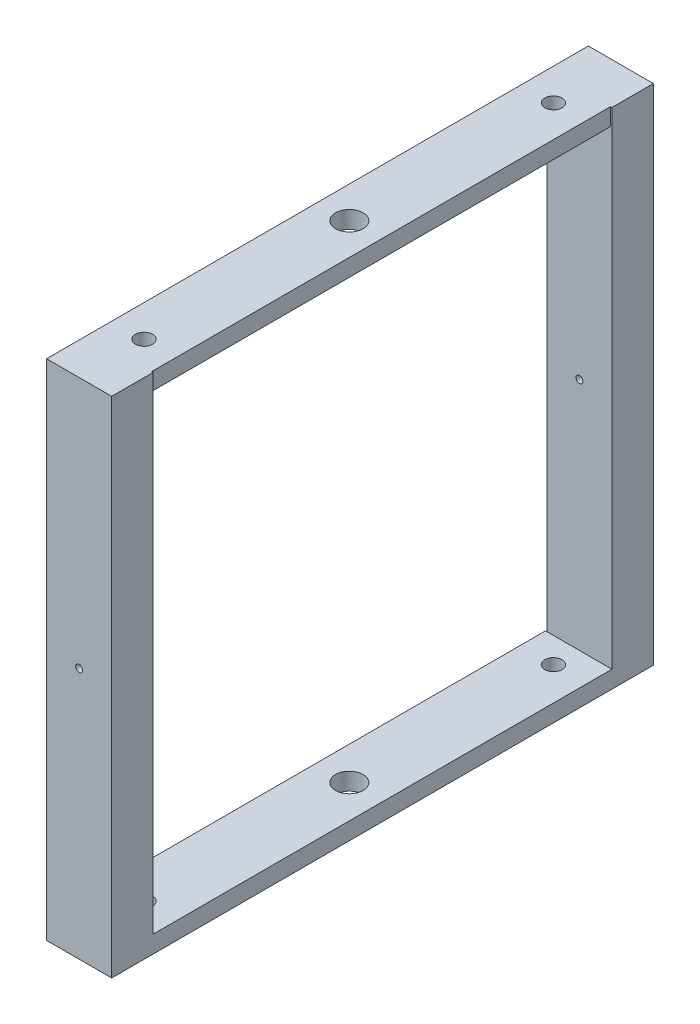
ISO-10303-21;
HEADER;
FILE_DESCRIPTION(('STEP AP214'),'2;1');
FILE_NAME('part.step','',(''),(''),'','','');
FILE_SCHEMA(('AUTOMOTIVE_DESIGN { 1 0 10303 214 1 1 1 1 }'));
ENDSEC;
DATA;
#1=APPLICATION_CONTEXT('core data for automotive mechanical design processes');
#2=APPLICATION_PROTOCOL_DEFINITION('international standard','automotive_design',2000,#1);
#3=PRODUCT_CONTEXT('',#1,'mechanical');
#4=PRODUCT('Part','Part','',(#3));
#5=PRODUCT_RELATED_PRODUCT_CATEGORY('part','',(#4));
#6=PRODUCT_DEFINITION_FORMATION('','',#4);
#7=PRODUCT_DEFINITION_CONTEXT('part definition',#1,'design');
#8=PRODUCT_DEFINITION('design','',#6,#7);
#9=PRODUCT_DEFINITION_SHAPE('','',#8);
#10=(LENGTH_UNIT() NAMED_UNIT(*) SI_UNIT(.MILLI.,.METRE.));
#11=(NAMED_UNIT(*) PLANE_ANGLE_UNIT() SI_UNIT($,.RADIAN.));
#12=(NAMED_UNIT(*) SI_UNIT($,.STERADIAN.) SOLID_ANGLE_UNIT());
#13=UNCERTAINTY_MEASURE_WITH_UNIT(LENGTH_MEASURE(1.E-05),#10,'distance_accuracy_value','');
#14=(GEOMETRIC_REPRESENTATION_CONTEXT(3) GLOBAL_UNCERTAINTY_ASSIGNED_CONTEXT((#13)) GLOBAL_UNIT_ASSIGNED_CONTEXT((#10,
#11,#12)) REPRESENTATION_CONTEXT('',''));
#15=CARTESIAN_POINT('',(0.,0.,0.));
#16=DIRECTION('',(0.,0.,1.));
#17=DIRECTION('',(1.,0.,0.));
#18=AXIS2_PLACEMENT_3D('',#15,#16,#17);
#19=CARTESIAN_POINT('',(-66.5,136.,66.5));
#20=DIRECTION('',(0.,0.,-1.));
#21=DIRECTION('',(-1.,0.,0.));
#22=AXIS2_PLACEMENT_3D('',#19,#20,#21);
#23=PLANE('',#22);
#24=DIRECTION('',(0.,-1.,0.));
#25=VECTOR('',#24,1.);
#26=CARTESIAN_POINT('',(-9.2186374950583,141.,66.5));
#27=LINE('',#26,#25);
#28=CARTESIAN_POINT('',(-9.2186374950583,0.,66.5));
#29=VERTEX_POINT('',#28);
#30=CARTESIAN_POINT('',(-9.2186374950583,-5.,66.5));
#31=VERTEX_POINT('',#30);
#32=EDGE_CURVE('E46',#29,#31,#27,.T.);
#33=ORIENTED_EDGE('',*,*,#32,.F.);
#34=DIRECTION('',(-1.,0.,0.));
#35=VECTOR('',#34,1.);
#36=CARTESIAN_POINT('',(103.5,0.,66.5));
#37=LINE('',#36,#35);
#38=CARTESIAN_POINT('',(-9.63074428145545,0.,66.5));
#39=VERTEX_POINT('',#38);
#40=EDGE_CURVE('E232',#29,#39,#37,.T.);
#41=ORIENTED_EDGE('',*,*,#40,.T.);
#42=DIRECTION('',(0.,1.,0.));
#43=VECTOR('',#42,1.);
#44=CARTESIAN_POINT('',(-9.63074428145545,-5.,66.5));
#45=LINE('',#44,#43);
#46=CARTESIAN_POINT('',(-9.63074428145545,-5.,66.5));
#47=VERTEX_POINT('',#46);
#48=EDGE_CURVE('E175',#47,#39,#45,.T.);
#49=ORIENTED_EDGE('',*,*,#48,.F.);
#50=DIRECTION('',(-1.,0.,0.));
#51=VECTOR('',#50,1.);
#52=CARTESIAN_POINT('',(-9.63074428145545,-5.,66.5));
#53=LINE('',#52,#51);
#54=EDGE_CURVE('E189',#31,#47,#53,.T.);
#55=ORIENTED_EDGE('',*,*,#54,.F.);
#56=EDGE_LOOP('',(#33,#41,#49,#55));
#57=FACE_BOUND('',#56,.T.);
#58=ADVANCED_FACE('F35',(#57),#23,.F.);
#59=CARTESIAN_POINT('',(-66.5,136.,-66.5));
#60=DIRECTION('',(0.,0.,1.));
#61=DIRECTION('',(1.,0.,0.));
#62=AXIS2_PLACEMENT_3D('',#59,#60,#61);
#63=PLANE('',#62);
#64=DIRECTION('',(0.,1.,0.));
#65=VECTOR('',#64,1.);
#66=CARTESIAN_POINT('',(-9.63074428145545,-5.,-66.5));
#67=LINE('',#66,#65);
#68=CARTESIAN_POINT('',(-9.63074428145545,-5.,-66.5));
#69=VERTEX_POINT('',#68);
#70=CARTESIAN_POINT('',(-9.63074428145545,0.,-66.5));
#71=VERTEX_POINT('',#70);
#72=EDGE_CURVE('E197',#69,#71,#67,.T.);
#73=ORIENTED_EDGE('',*,*,#72,.T.);
#74=DIRECTION('',(-1.,0.,0.));
#75=VECTOR('',#74,1.);
#76=CARTESIAN_POINT('',(103.5,0.,-66.5));
#77=LINE('',#76,#75);
#78=CARTESIAN_POINT('',(-9.2186374950583,0.,-66.5));
#79=VERTEX_POINT('',#78);
#80=EDGE_CURVE('E228',#79,#71,#77,.T.);
#81=ORIENTED_EDGE('',*,*,#80,.F.);
#82=DIRECTION('',(0.,1.,0.));
#83=VECTOR('',#82,1.);
#84=CARTESIAN_POINT('',(-9.2186374950583,-5.,-66.5));
#85=LINE('',#84,#83);
#86=CARTESIAN_POINT('',(-9.2186374950583,-5.,-66.5));
#87=VERTEX_POINT('',#86);
#88=EDGE_CURVE('E157',#87,#79,#85,.T.);
#89=ORIENTED_EDGE('',*,*,#88,.F.);
#90=DIRECTION('',(1.,0.,0.));
#91=VECTOR('',#90,1.);
#92=CARTESIAN_POINT('',(-9.63074428145545,-5.,-66.5));
#93=LINE('',#92,#91);
#94=EDGE_CURVE('E194',#69,#87,#93,.T.);
#95=ORIENTED_EDGE('',*,*,#94,.F.);
#96=EDGE_LOOP('',(#73,#81,#89,#95));
#97=FACE_BOUND('',#96,.T.);
#98=ADVANCED_FACE('F37',(#97),#63,.F.);
#99=CARTESIAN_POINT('',(9.63074428145545,-5.,-66.5));
#100=DIRECTION('',(-1.,0.,0.));
#101=DIRECTION('',(0.,0.,1.));
#102=AXIS2_PLACEMENT_3D('',#99,#100,#101);
#103=PLANE('',#102);
#104=DIRECTION('',(0.,0.,1.));
#105=VECTOR('',#104,1.);
#106=CARTESIAN_POINT('',(9.63074428145545,0.,-66.5));
#107=LINE('',#106,#105);
#108=CARTESIAN_POINT('',(9.63074428145545,0.,-66.5));
#109=VERTEX_POINT('',#108);
#110=CARTESIAN_POINT('',(9.63074428145545,0.,66.5));
#111=VERTEX_POINT('',#110);
#112=EDGE_CURVE('E186',#109,#111,#107,.T.);
#113=ORIENTED_EDGE('',*,*,#112,.T.);
#114=DIRECTION('',(0.,1.,0.));
#115=VECTOR('',#114,1.);
#116=CARTESIAN_POINT('',(9.63074428145545,141.,66.5));
#117=LINE('',#116,#115);
#118=CARTESIAN_POINT('',(9.63074428145545,141.,66.5));
#119=VERTEX_POINT('',#118);
#120=EDGE_CURVE('E44',#111,#119,#117,.T.);
#121=ORIENTED_EDGE('',*,*,#120,.T.);
#122=DIRECTION('',(0.,0.,-1.));
#123=VECTOR('',#122,1.);
#124=CARTESIAN_POINT('',(9.63074428145545,141.,78.5));
#125=LINE('',#124,#123);
#126=CARTESIAN_POINT('',(9.63074428145545,141.,78.5));
#127=VERTEX_POINT('',#126);
#128=EDGE_CURVE('E259',#127,#119,#125,.T.);
#129=ORIENTED_EDGE('',*,*,#128,.F.);
#130=DIRECTION('',(0.,1.,0.));
#131=VECTOR('',#130,1.);
#132=CARTESIAN_POINT('',(9.63074428145545,141.,78.5));
#133=LINE('',#132,#131);
#134=CARTESIAN_POINT('',(9.63074428145545,-5.,78.5));
#135=VERTEX_POINT('',#134);
#136=EDGE_CURVE('E255',#135,#127,#133,.T.);
#137=ORIENTED_EDGE('',*,*,#136,.F.);
#138=DIRECTION('',(0.,0.,1.));
#139=VECTOR('',#138,1.);
#140=CARTESIAN_POINT('',(9.63074428145545,-5.,-66.5));
#141=LINE('',#140,#139);
#142=CARTESIAN_POINT('',(9.63074428145545,-5.,-78.5));
#143=VERTEX_POINT('',#142);
#144=EDGE_CURVE('E187',#143,#135,#141,.T.);
#145=ORIENTED_EDGE('',*,*,#144,.F.);
#146=DIRECTION('',(0.,-1.,0.));
#147=VECTOR('',#146,1.);
#148=CARTESIAN_POINT('',(9.63074428145545,-5.,-78.5));
#149=LINE('',#148,#147);
#150=CARTESIAN_POINT('',(9.63074428145545,141.,-78.5));
#151=VERTEX_POINT('',#150);
#152=EDGE_CURVE('E163',#151,#143,#149,.T.);
#153=ORIENTED_EDGE('',*,*,#152,.F.);
#154=DIRECTION('',(0.,0.,1.));
#155=VECTOR('',#154,1.);
#156=CARTESIAN_POINT('',(9.63074428145545,141.,-78.5));
#157=LINE('',#156,#155);
#158=CARTESIAN_POINT('',(9.63074428145545,141.,-66.5));
#159=VERTEX_POINT('',#158);
#160=EDGE_CURVE('E172',#151,#159,#157,.T.);
#161=ORIENTED_EDGE('',*,*,#160,.T.);
#162=DIRECTION('',(0.,-1.,0.));
#163=VECTOR('',#162,1.);
#164=CARTESIAN_POINT('',(9.63074428145545,-5.,-66.5));
#165=LINE('',#164,#163);
#166=EDGE_CURVE('E173',#159,#109,#165,.T.);
#167=ORIENTED_EDGE('',*,*,#166,.T.);
#168=EDGE_LOOP('',(#113,#121,#129,#137,#145,#153,#161,#167));
#169=FACE_BOUND('',#168,.T.);
#170=ADVANCED_FACE('F305',(#169),#103,.F.);
#171=CARTESIAN_POINT('',(-9.63074428145545,-5.,-66.5));
#172=DIRECTION('',(1.,0.,0.));
#173=DIRECTION('',(0.,0.,-1.));
#174=AXIS2_PLACEMENT_3D('',#171,#172,#173);
#175=PLANE('',#174);
#176=DIRECTION('',(0.,0.,-1.));
#177=VECTOR('',#176,1.);
#178=CARTESIAN_POINT('',(-9.63074428145545,0.,-66.5));
#179=LINE('',#178,#177);
#180=EDGE_CURVE('E190',#39,#71,#179,.T.);
#181=ORIENTED_EDGE('',*,*,#180,.T.);
#182=ORIENTED_EDGE('',*,*,#72,.F.);
#183=DIRECTION('',(0.,0.,-1.));
#184=VECTOR('',#183,1.);
#185=CARTESIAN_POINT('',(-9.63074428145545,-5.,-66.5));
#186=LINE('',#185,#184);
#187=EDGE_CURVE('E192',#47,#69,#186,.T.);
#188=ORIENTED_EDGE('',*,*,#187,.F.);
#189=ORIENTED_EDGE('',*,*,#48,.T.);
#190=EDGE_LOOP('',(#181,#182,#188,#189));
#191=FACE_BOUND('',#190,.T.);
#192=ADVANCED_FACE('F280',(#191),#175,.F.);
#193=CARTESIAN_POINT('',(0.,-5.,0.));
#194=DIRECTION('',(0.,1.,0.));
#195=DIRECTION('',(0.,0.,1.));
#196=AXIS2_PLACEMENT_3D('',#193,#194,#195);
#197=PLANE('',#196);
#198=CARTESIAN_POINT('',(0.,-5.,0.));
#199=DIRECTION('',(0.,1.,0.));
#200=DIRECTION('',(0.,0.,1.));
#201=AXIS2_PLACEMENT_3D('',#198,#199,#200);
#202=CIRCLE('',#201,4.);
#203=CARTESIAN_POINT('',(0.,-5.,4.));
#204=VERTEX_POINT('',#203);
#205=EDGE_CURVE('E391',#204,#204,#202,.T.);
#206=ORIENTED_EDGE('',*,*,#205,.T.);
#207=EDGE_LOOP('',(#206));
#208=FACE_BOUND('',#207,.T.);
#209=CARTESIAN_POINT('',(0.,-5.,59.4994711224337));
#210=DIRECTION('',(0.,1.,0.));
#211=DIRECTION('',(0.,0.,1.));
#212=AXIS2_PLACEMENT_3D('',#209,#210,#211);
#213=CIRCLE('',#212,2.5);
#214=CARTESIAN_POINT('',(0.,-5.,61.9994711224337));
#215=VERTEX_POINT('',#214);
#216=EDGE_CURVE('E208',#215,#215,#213,.T.);
#217=ORIENTED_EDGE('',*,*,#216,.T.);
#218=EDGE_LOOP('',(#217));
#219=FACE_BOUND('',#218,.T.);
#220=CARTESIAN_POINT('',(0.,-5.,-59.1597976431427));
#221=DIRECTION('',(0.,1.,0.));
#222=DIRECTION('',(0.,0.,1.));
#223=AXIS2_PLACEMENT_3D('',#220,#221,#222);
#224=CIRCLE('',#223,2.5);
#225=CARTESIAN_POINT('',(0.,-5.,-56.6597976431427));
#226=VERTEX_POINT('',#225);
#227=EDGE_CURVE('E226',#226,#226,#224,.T.);
#228=ORIENTED_EDGE('',*,*,#227,.T.);
#229=EDGE_LOOP('',(#228));
#230=FACE_BOUND('',#229,.T.);
#231=ORIENTED_EDGE('',*,*,#144,.T.);
#232=DIRECTION('',(1.,0.,0.));
#233=VECTOR('',#232,1.);
#234=CARTESIAN_POINT('',(-9.2186374950583,-5.,78.5));
#235=LINE('',#234,#233);
#236=CARTESIAN_POINT('',(-9.2186374950583,-5.,78.5));
#237=VERTEX_POINT('',#236);
#238=EDGE_CURVE('E251',#237,#135,#235,.T.);
#239=ORIENTED_EDGE('',*,*,#238,.F.);
#240=DIRECTION('',(0.,0.,-1.));
#241=VECTOR('',#240,1.);
#242=CARTESIAN_POINT('',(-9.2186374950583,-5.,78.5));
#243=LINE('',#242,#241);
#244=EDGE_CURVE('E149',#237,#31,#243,.T.);
#245=ORIENTED_EDGE('',*,*,#244,.T.);
#246=ORIENTED_EDGE('',*,*,#54,.T.);
#247=ORIENTED_EDGE('',*,*,#187,.T.);
#248=ORIENTED_EDGE('',*,*,#94,.T.);
#249=DIRECTION('',(0.,0.,1.));
#250=VECTOR('',#249,1.);
#251=CARTESIAN_POINT('',(-9.2186374950583,-5.,-78.5));
#252=LINE('',#251,#250);
#253=CARTESIAN_POINT('',(-9.2186374950583,-5.,-78.5));
#254=VERTEX_POINT('',#253);
#255=EDGE_CURVE('E183',#254,#87,#252,.T.);
#256=ORIENTED_EDGE('',*,*,#255,.F.);
#257=DIRECTION('',(-1.,0.,0.));
#258=VECTOR('',#257,1.);
#259=CARTESIAN_POINT('',(9.63074428145545,-5.,-78.5));
#260=LINE('',#259,#258);
#261=EDGE_CURVE('E166',#143,#254,#260,.T.);
#262=ORIENTED_EDGE('',*,*,#261,.F.);
#263=EDGE_LOOP('',(#231,#239,#245,#246,#247,#248,#256,#262));
#264=FACE_BOUND('',#263,.T.);
#265=ADVANCED_FACE('F285',(#208,#219,#230,#264),#197,.F.);
#266=CARTESIAN_POINT('',(-9.2186374950583,-5.,-78.5));
#267=DIRECTION('',(1.,0.,0.));
#268=DIRECTION('',(0.,0.,-1.));
#269=AXIS2_PLACEMENT_3D('',#266,#267,#268);
#270=PLANE('',#269);
#271=ORIENTED_EDGE('',*,*,#88,.T.);
#272=CARTESIAN_POINT('',(-9.2186374950583,136.,-66.5));
#273=VERTEX_POINT('',#272);
#274=EDGE_CURVE('E155',#79,#273,#85,.T.);
#275=ORIENTED_EDGE('',*,*,#274,.T.);
#276=DIRECTION('',(0.,0.,1.));
#277=VECTOR('',#276,1.);
#278=CARTESIAN_POINT('',(-9.2186374950583,136.,66.5));
#279=LINE('',#278,#277);
#280=CARTESIAN_POINT('',(-9.2186374950583,136.,66.5));
#281=VERTEX_POINT('',#280);
#282=EDGE_CURVE('E137',#273,#281,#279,.T.);
#283=ORIENTED_EDGE('',*,*,#282,.T.);
#284=EDGE_CURVE('E11',#281,#29,#27,.T.);
#285=ORIENTED_EDGE('',*,*,#284,.T.);
#286=ORIENTED_EDGE('',*,*,#32,.T.);
#287=ORIENTED_EDGE('',*,*,#244,.F.);
#288=DIRECTION('',(0.,-1.,0.));
#289=VECTOR('',#288,1.);
#290=CARTESIAN_POINT('',(-9.2186374950583,141.,78.5));
#291=LINE('',#290,#289);
#292=CARTESIAN_POINT('',(-9.2186374950583,141.,78.5));
#293=VERTEX_POINT('',#292);
#294=EDGE_CURVE('E248',#293,#237,#291,.T.);
#295=ORIENTED_EDGE('',*,*,#294,.F.);
#296=DIRECTION('',(0.,0.,1.));
#297=VECTOR('',#296,1.);
#298=CARTESIAN_POINT('',(-9.2186374950583,141.,-78.5));
#299=LINE('',#298,#297);
#300=CARTESIAN_POINT('',(-9.2186374950583,141.,-78.5));
#301=VERTEX_POINT('',#300);
#302=EDGE_CURVE('E181',#301,#293,#299,.T.);
#303=ORIENTED_EDGE('',*,*,#302,.F.);
#304=DIRECTION('',(0.,1.,0.));
#305=VECTOR('',#304,1.);
#306=CARTESIAN_POINT('',(-9.2186374950583,-5.,-78.5));
#307=LINE('',#306,#305);
#308=EDGE_CURVE('E168',#254,#301,#307,.T.);
#309=ORIENTED_EDGE('',*,*,#308,.F.);
#310=ORIENTED_EDGE('',*,*,#255,.T.);
#311=EDGE_LOOP('',(#271,#275,#283,#285,#286,#287,#295,#303,#309,#310));
#312=FACE_BOUND('',#311,.T.);
#313=ADVANCED_FACE('F268',(#312),#270,.F.);
#314=CARTESIAN_POINT('',(9.63074428145545,141.,-78.5));
#315=DIRECTION('',(0.,-1.,0.));
#316=DIRECTION('',(0.,0.,-1.));
#317=AXIS2_PLACEMENT_3D('',#314,#315,#316);
#318=PLANE('',#317);
#319=CARTESIAN_POINT('',(0.,141.,0.));
#320=DIRECTION('',(0.,1.,0.));
#321=DIRECTION('',(0.,0.,1.));
#322=AXIS2_PLACEMENT_3D('',#319,#320,#321);
#323=CIRCLE('',#322,4.);
#324=CARTESIAN_POINT('',(0.,141.,4.));
#325=VERTEX_POINT('',#324);
#326=EDGE_CURVE('E407',#325,#325,#323,.T.);
#327=ORIENTED_EDGE('',*,*,#326,.F.);
#328=EDGE_LOOP('',(#327));
#329=FACE_BOUND('',#328,.T.);
#330=CARTESIAN_POINT('',(0.,141.,59.4994711224337));
#331=DIRECTION('',(0.,-1.,0.));
#332=DIRECTION('',(0.,0.,-1.));
#333=AXIS2_PLACEMENT_3D('',#330,#331,#332);
#334=CIRCLE('',#333,2.5);
#335=CARTESIAN_POINT('',(0.,141.,56.9994711224337));
#336=VERTEX_POINT('',#335);
#337=EDGE_CURVE('E220',#336,#336,#334,.T.);
#338=ORIENTED_EDGE('',*,*,#337,.T.);
#339=EDGE_LOOP('',(#338));
#340=FACE_BOUND('',#339,.T.);
#341=CARTESIAN_POINT('',(0.,141.,-59.1597976431427));
#342=DIRECTION('',(0.,-1.,0.));
#343=DIRECTION('',(0.,0.,-1.));
#344=AXIS2_PLACEMENT_3D('',#341,#342,#343);
#345=CIRCLE('',#344,2.47472267057679);
#346=CARTESIAN_POINT('',(0.,141.,-61.6345203137195));
#347=VERTEX_POINT('',#346);
#348=EDGE_CURVE('E207',#347,#347,#345,.F.);
#349=ORIENTED_EDGE('',*,*,#348,.F.);
#350=EDGE_LOOP('',(#349));
#351=FACE_BOUND('',#350,.T.);
#352=ORIENTED_EDGE('',*,*,#302,.T.);
#353=DIRECTION('',(-1.,0.,0.));
#354=VECTOR('',#353,1.);
#355=CARTESIAN_POINT('',(-9.2186374950583,141.,78.5));
#356=LINE('',#355,#354);
#357=EDGE_CURVE('E257',#127,#293,#356,.T.);
#358=ORIENTED_EDGE('',*,*,#357,.F.);
#359=ORIENTED_EDGE('',*,*,#128,.T.);
#360=DIRECTION('',(-1.,0.,0.));
#361=VECTOR('',#360,1.);
#362=CARTESIAN_POINT('',(-9.2186374950583,141.,66.5));
#363=LINE('',#362,#361);
#364=CARTESIAN_POINT('',(9.21863749505819,141.,66.5));
#365=VERTEX_POINT('',#364);
#366=EDGE_CURVE('E252',#119,#365,#363,.T.);
#367=ORIENTED_EDGE('',*,*,#366,.T.);
#368=DIRECTION('',(0.,0.,-1.));
#369=VECTOR('',#368,1.);
#370=CARTESIAN_POINT('',(9.21863749505819,141.,66.5));
#371=LINE('',#370,#369);
#372=CARTESIAN_POINT('',(9.21863749505819,141.,-66.5));
#373=VERTEX_POINT('',#372);
#374=EDGE_CURVE('E159',#365,#373,#371,.T.);
#375=ORIENTED_EDGE('',*,*,#374,.T.);
#376=DIRECTION('',(1.,0.,0.));
#377=VECTOR('',#376,1.);
#378=CARTESIAN_POINT('',(9.63074428145545,141.,-66.5));
#379=LINE('',#378,#377);
#380=EDGE_CURVE('E154',#373,#159,#379,.T.);
#381=ORIENTED_EDGE('',*,*,#380,.T.);
#382=ORIENTED_EDGE('',*,*,#160,.F.);
#383=DIRECTION('',(1.,0.,0.));
#384=VECTOR('',#383,1.);
#385=CARTESIAN_POINT('',(9.63074428145545,141.,-78.5));
#386=LINE('',#385,#384);
#387=EDGE_CURVE('E170',#301,#151,#386,.T.);
#388=ORIENTED_EDGE('',*,*,#387,.F.);
#389=EDGE_LOOP('',(#352,#358,#359,#367,#375,#381,#382,#388));
#390=FACE_BOUND('',#389,.T.);
#391=ADVANCED_FACE('F296',(#329,#340,#351,#390),#318,.F.);
#392=CARTESIAN_POINT('',(0.,0.,-78.5));
#393=DIRECTION('',(0.,0.,1.));
#394=DIRECTION('',(1.,0.,0.));
#395=AXIS2_PLACEMENT_3D('',#392,#393,#394);
#396=PLANE('',#395);
#397=CARTESIAN_POINT('',(0.206053393198581,68.,-78.5));
#398=DIRECTION('',(0.,0.,1.));
#399=DIRECTION('',(1.,0.,0.));
#400=AXIS2_PLACEMENT_3D('',#397,#398,#399);
#401=CIRCLE('',#400,1.);
#402=CARTESIAN_POINT('',(1.20605339319858,68.,-78.5));
#403=VERTEX_POINT('',#402);
#404=EDGE_CURVE('E237',#403,#403,#401,.T.);
#405=ORIENTED_EDGE('',*,*,#404,.T.);
#406=EDGE_LOOP('',(#405));
#407=FACE_BOUND('',#406,.T.);
#408=ORIENTED_EDGE('',*,*,#152,.T.);
#409=ORIENTED_EDGE('',*,*,#261,.T.);
#410=ORIENTED_EDGE('',*,*,#308,.T.);
#411=ORIENTED_EDGE('',*,*,#387,.T.);
#412=EDGE_LOOP('',(#408,#409,#410,#411));
#413=FACE_BOUND('',#412,.T.);
#414=ADVANCED_FACE('F301',(#407,#413),#396,.F.);
#415=CARTESIAN_POINT('',(0.,0.,-66.5));
#416=DIRECTION('',(0.,0.,1.));
#417=DIRECTION('',(1.,0.,0.));
#418=AXIS2_PLACEMENT_3D('',#415,#416,#417);
#419=PLANE('',#418);
#420=CARTESIAN_POINT('',(0.206053393198581,68.,-66.5));
#421=DIRECTION('',(0.,0.,1.));
#422=DIRECTION('',(1.,0.,0.));
#423=AXIS2_PLACEMENT_3D('',#420,#421,#422);
#424=CIRCLE('',#423,1.);
#425=CARTESIAN_POINT('',(1.20605339319858,68.,-66.5));
#426=VERTEX_POINT('',#425);
#427=EDGE_CURVE('E245',#426,#426,#424,.T.);
#428=ORIENTED_EDGE('',*,*,#427,.F.);
#429=EDGE_LOOP('',(#428));
#430=FACE_BOUND('',#429,.T.);
#431=ORIENTED_EDGE('',*,*,#166,.F.);
#432=ORIENTED_EDGE('',*,*,#380,.F.);
#433=DIRECTION('',(0.,-1.,0.));
#434=VECTOR('',#433,1.);
#435=CARTESIAN_POINT('',(9.21863749505819,141.,-66.5));
#436=LINE('',#435,#434);
#437=CARTESIAN_POINT('',(9.21863749505819,136.,-66.5));
#438=VERTEX_POINT('',#437);
#439=EDGE_CURVE('E145',#373,#438,#436,.T.);
#440=ORIENTED_EDGE('',*,*,#439,.T.);
#441=DIRECTION('',(-1.,0.,0.));
#442=VECTOR('',#441,1.);
#443=CARTESIAN_POINT('',(103.5,136.,-66.5));
#444=LINE('',#443,#442);
#445=EDGE_CURVE('E131',#438,#273,#444,.T.);
#446=ORIENTED_EDGE('',*,*,#445,.T.);
#447=ORIENTED_EDGE('',*,*,#274,.F.);
#448=EDGE_CURVE('E235',#109,#79,#77,.T.);
#449=ORIENTED_EDGE('',*,*,#448,.F.);
#450=EDGE_LOOP('',(#431,#432,#440,#446,#447,#449));
#451=FACE_BOUND('',#450,.T.);
#452=ADVANCED_FACE('F152',(#430,#451),#419,.T.);
#453=CARTESIAN_POINT('',(9.21863749505819,141.,66.5));
#454=DIRECTION('',(-1.,0.,0.));
#455=DIRECTION('',(0.,0.,1.));
#456=AXIS2_PLACEMENT_3D('',#453,#454,#455);
#457=PLANE('',#456);
#458=DIRECTION('',(0.,0.,-1.));
#459=VECTOR('',#458,1.);
#460=CARTESIAN_POINT('',(9.21863749505819,136.,66.5));
#461=LINE('',#460,#459);
#462=CARTESIAN_POINT('',(9.21863749505819,136.,66.5));
#463=VERTEX_POINT('',#462);
#464=EDGE_CURVE('E135',#463,#438,#461,.T.);
#465=ORIENTED_EDGE('',*,*,#464,.T.);
#466=ORIENTED_EDGE('',*,*,#439,.F.);
#467=ORIENTED_EDGE('',*,*,#374,.F.);
#468=DIRECTION('',(0.,-1.,0.));
#469=VECTOR('',#468,1.);
#470=CARTESIAN_POINT('',(9.21863749505819,141.,66.5));
#471=LINE('',#470,#469);
#472=EDGE_CURVE('E148',#365,#463,#471,.T.);
#473=ORIENTED_EDGE('',*,*,#472,.T.);
#474=EDGE_LOOP('',(#465,#466,#467,#473));
#475=FACE_BOUND('',#474,.T.);
#476=ADVANCED_FACE('F144',(#475),#457,.F.);
#477=CARTESIAN_POINT('',(0.,0.,66.5));
#478=DIRECTION('',(0.,0.,1.));
#479=DIRECTION('',(1.,0.,0.));
#480=AXIS2_PLACEMENT_3D('',#477,#478,#479);
#481=PLANE('',#480);
#482=CARTESIAN_POINT('',(0.206053393198581,68.,66.5));
#483=DIRECTION('',(0.,0.,1.));
#484=DIRECTION('',(1.,0.,0.));
#485=AXIS2_PLACEMENT_3D('',#482,#483,#484);
#486=CIRCLE('',#485,1.);
#487=CARTESIAN_POINT('',(1.20605339319858,68.,66.5));
#488=VERTEX_POINT('',#487);
#489=EDGE_CURVE('E240',#488,#488,#486,.T.);
#490=ORIENTED_EDGE('',*,*,#489,.T.);
#491=EDGE_LOOP('',(#490));
#492=FACE_BOUND('',#491,.T.);
#493=ORIENTED_EDGE('',*,*,#120,.F.);
#494=EDGE_CURVE('E231',#111,#29,#37,.T.);
#495=ORIENTED_EDGE('',*,*,#494,.T.);
#496=ORIENTED_EDGE('',*,*,#284,.F.);
#497=DIRECTION('',(-1.,0.,0.));
#498=VECTOR('',#497,1.);
#499=CARTESIAN_POINT('',(103.5,136.,66.5));
#500=LINE('',#499,#498);
#501=EDGE_CURVE('E141',#463,#281,#500,.T.);
#502=ORIENTED_EDGE('',*,*,#501,.F.);
#503=ORIENTED_EDGE('',*,*,#472,.F.);
#504=ORIENTED_EDGE('',*,*,#366,.F.);
#505=EDGE_LOOP('',(#493,#495,#496,#502,#503,#504));
#506=FACE_BOUND('',#505,.T.);
#507=ADVANCED_FACE('F307',(#492,#506),#481,.F.);
#508=CARTESIAN_POINT('',(0.,0.,78.5));
#509=DIRECTION('',(0.,0.,1.));
#510=DIRECTION('',(1.,0.,0.));
#511=AXIS2_PLACEMENT_3D('',#508,#509,#510);
#512=PLANE('',#511);
#513=CARTESIAN_POINT('',(0.206053393198581,68.,78.5));
#514=DIRECTION('',(0.,0.,1.));
#515=DIRECTION('',(1.,0.,0.));
#516=AXIS2_PLACEMENT_3D('',#513,#514,#515);
#517=CIRCLE('',#516,1.);
#518=CARTESIAN_POINT('',(1.20605339319858,68.,78.5));
#519=VERTEX_POINT('',#518);
#520=EDGE_CURVE('E140',#519,#519,#517,.T.);
#521=ORIENTED_EDGE('',*,*,#520,.F.);
#522=EDGE_LOOP('',(#521));
#523=FACE_BOUND('',#522,.T.);
#524=ORIENTED_EDGE('',*,*,#294,.T.);
#525=ORIENTED_EDGE('',*,*,#238,.T.);
#526=ORIENTED_EDGE('',*,*,#136,.T.);
#527=ORIENTED_EDGE('',*,*,#357,.T.);
#528=EDGE_LOOP('',(#524,#525,#526,#527));
#529=FACE_BOUND('',#528,.T.);
#530=ADVANCED_FACE('F291',(#523,#529),#512,.T.);
#531=CARTESIAN_POINT('',(0.206053393198581,68.,-78.5));
#532=DIRECTION('',(0.,0.,1.));
#533=DIRECTION('',(1.,0.,0.));
#534=AXIS2_PLACEMENT_3D('',#531,#532,#533);
#535=CYLINDRICAL_SURFACE('',#534,1.);
#536=ORIENTED_EDGE('',*,*,#520,.T.);
#537=EDGE_LOOP('',(#536));
#538=FACE_BOUND('',#537,.T.);
#539=ORIENTED_EDGE('',*,*,#489,.F.);
#540=EDGE_LOOP('',(#539));
#541=FACE_BOUND('',#540,.T.);
#542=ADVANCED_FACE('F316',(#538,#541),#535,.F.);
#543=ORIENTED_EDGE('',*,*,#427,.T.);
#544=EDGE_LOOP('',(#543));
#545=FACE_BOUND('',#544,.T.);
#546=ORIENTED_EDGE('',*,*,#404,.F.);
#547=EDGE_LOOP('',(#546));
#548=FACE_BOUND('',#547,.T.);
#549=ADVANCED_FACE('F349',(#545,#548),#535,.F.);
#550=CARTESIAN_POINT('',(103.5,136.,-66.5));
#551=DIRECTION('',(0.,1.,0.));
#552=DIRECTION('',(0.,0.,1.));
#553=AXIS2_PLACEMENT_3D('',#550,#551,#552);
#554=PLANE('',#553);
#555=CARTESIAN_POINT('',(0.,136.,0.));
#556=DIRECTION('',(0.,1.,0.));
#557=DIRECTION('',(0.,0.,1.));
#558=AXIS2_PLACEMENT_3D('',#555,#556,#557);
#559=CIRCLE('',#558,4.);
#560=CARTESIAN_POINT('',(0.,136.,4.));
#561=VERTEX_POINT('',#560);
#562=EDGE_CURVE('E393',#561,#561,#559,.T.);
#563=ORIENTED_EDGE('',*,*,#562,.T.);
#564=EDGE_LOOP('',(#563));
#565=FACE_BOUND('',#564,.T.);
#566=CARTESIAN_POINT('',(0.,136.,59.4994711224337));
#567=DIRECTION('',(0.,1.,0.));
#568=DIRECTION('',(0.,0.,1.));
#569=AXIS2_PLACEMENT_3D('',#566,#567,#568);
#570=CIRCLE('',#569,2.5);
#571=CARTESIAN_POINT('',(0.,136.,61.9994711224337));
#572=VERTEX_POINT('',#571);
#573=EDGE_CURVE('E392',#572,#572,#570,.T.);
#574=ORIENTED_EDGE('',*,*,#573,.T.);
#575=EDGE_LOOP('',(#574));
#576=FACE_BOUND('',#575,.T.);
#577=CARTESIAN_POINT('',(0.,136.,-59.1597976431427));
#578=DIRECTION('',(0.,1.,0.));
#579=DIRECTION('',(0.,0.,1.));
#580=AXIS2_PLACEMENT_3D('',#577,#578,#579);
#581=CIRCLE('',#580,2.47472267057679);
#582=CARTESIAN_POINT('',(0.,136.,-56.6850749725659));
#583=VERTEX_POINT('',#582);
#584=EDGE_CURVE('E205',#583,#583,#581,.F.);
#585=ORIENTED_EDGE('',*,*,#584,.F.);
#586=EDGE_LOOP('',(#585));
#587=FACE_BOUND('',#586,.T.);
#588=ORIENTED_EDGE('',*,*,#445,.F.);
#589=ORIENTED_EDGE('',*,*,#464,.F.);
#590=ORIENTED_EDGE('',*,*,#501,.T.);
#591=ORIENTED_EDGE('',*,*,#282,.F.);
#592=EDGE_LOOP('',(#588,#589,#590,#591));
#593=FACE_BOUND('',#592,.T.);
#594=ADVANCED_FACE('F133',(#565,#576,#587,#593),#554,.F.);
#595=CARTESIAN_POINT('',(103.5,0.,-66.5));
#596=DIRECTION('',(0.,-1.,0.));
#597=DIRECTION('',(0.,0.,-1.));
#598=AXIS2_PLACEMENT_3D('',#595,#596,#597);
#599=PLANE('',#598);
#600=CARTESIAN_POINT('',(0.,0.,0.));
#601=DIRECTION('',(0.,-1.,0.));
#602=DIRECTION('',(0.,0.,-1.));
#603=AXIS2_PLACEMENT_3D('',#600,#601,#602);
#604=CIRCLE('',#603,4.);
#605=CARTESIAN_POINT('',(0.,0.,-4.));
#606=VERTEX_POINT('',#605);
#607=EDGE_CURVE('E39',#606,#606,#604,.T.);
#608=ORIENTED_EDGE('',*,*,#607,.T.);
#609=EDGE_LOOP('',(#608));
#610=FACE_BOUND('',#609,.T.);
#611=CARTESIAN_POINT('',(0.,0.,59.4994711224337));
#612=DIRECTION('',(0.,1.,0.));
#613=DIRECTION('',(0.,0.,1.));
#614=AXIS2_PLACEMENT_3D('',#611,#612,#613);
#615=CIRCLE('',#614,2.5);
#616=CARTESIAN_POINT('',(0.,0.,61.9994711224337));
#617=VERTEX_POINT('',#616);
#618=EDGE_CURVE('E215',#617,#617,#615,.T.);
#619=ORIENTED_EDGE('',*,*,#618,.F.);
#620=EDGE_LOOP('',(#619));
#621=FACE_BOUND('',#620,.T.);
#622=CARTESIAN_POINT('',(0.,0.,-59.1597976431427));
#623=DIRECTION('',(0.,1.,0.));
#624=DIRECTION('',(0.,0.,1.));
#625=AXIS2_PLACEMENT_3D('',#622,#623,#624);
#626=CIRCLE('',#625,2.5);
#627=CARTESIAN_POINT('',(0.,0.,-56.6597976431427));
#628=VERTEX_POINT('',#627);
#629=EDGE_CURVE('E212',#628,#628,#626,.T.);
#630=ORIENTED_EDGE('',*,*,#629,.F.);
#631=EDGE_LOOP('',(#630));
#632=FACE_BOUND('',#631,.T.);
#633=ORIENTED_EDGE('',*,*,#448,.T.);
#634=ORIENTED_EDGE('',*,*,#80,.T.);
#635=ORIENTED_EDGE('',*,*,#180,.F.);
#636=ORIENTED_EDGE('',*,*,#40,.F.);
#637=ORIENTED_EDGE('',*,*,#494,.F.);
#638=ORIENTED_EDGE('',*,*,#112,.F.);
#639=EDGE_LOOP('',(#633,#634,#635,#636,#637,#638));
#640=FACE_BOUND('',#639,.T.);
#641=ADVANCED_FACE('F273',(#610,#621,#632,#640),#599,.F.);
#642=CARTESIAN_POINT('',(0.,-170.,-59.1597976431427));
#643=DIRECTION('',(0.,1.,0.));
#644=DIRECTION('',(0.,0.,1.));
#645=AXIS2_PLACEMENT_3D('',#642,#643,#644);
#646=CYLINDRICAL_SURFACE('',#645,2.5);
#647=ORIENTED_EDGE('',*,*,#629,.T.);
#648=EDGE_LOOP('',(#647));
#649=FACE_BOUND('',#648,.T.);
#650=ORIENTED_EDGE('',*,*,#227,.F.);
#651=EDGE_LOOP('',(#650));
#652=FACE_BOUND('',#651,.T.);
#653=ADVANCED_FACE('F361',(#649,#652),#646,.F.);
#654=CARTESIAN_POINT('',(0.,186.,-59.1597976431427));
#655=DIRECTION('',(0.,-1.,0.));
#656=DIRECTION('',(0.,0.,-1.));
#657=AXIS2_PLACEMENT_3D('',#654,#655,#656);
#658=CYLINDRICAL_SURFACE('',#657,2.47472267057679);
#659=ORIENTED_EDGE('',*,*,#584,.T.);
#660=EDGE_LOOP('',(#659));
#661=FACE_BOUND('',#660,.T.);
#662=ORIENTED_EDGE('',*,*,#348,.T.);
#663=EDGE_LOOP('',(#662));
#664=FACE_BOUND('',#663,.T.);
#665=ADVANCED_FACE('F366',(#661,#664),#658,.F.);
#666=CARTESIAN_POINT('',(0.,-177.,59.4994711224337));
#667=DIRECTION('',(0.,1.,0.));
#668=DIRECTION('',(0.,0.,1.));
#669=AXIS2_PLACEMENT_3D('',#666,#667,#668);
#670=CYLINDRICAL_SURFACE('',#669,2.5);
#671=ORIENTED_EDGE('',*,*,#618,.T.);
#672=EDGE_LOOP('',(#671));
#673=FACE_BOUND('',#672,.T.);
#674=ORIENTED_EDGE('',*,*,#216,.F.);
#675=EDGE_LOOP('',(#674));
#676=FACE_BOUND('',#675,.T.);
#677=ADVANCED_FACE('F370',(#673,#676),#670,.F.);
#678=CARTESIAN_POINT('',(0.,172.,59.4994711224337));
#679=DIRECTION('',(0.,-1.,0.));
#680=DIRECTION('',(0.,0.,-1.));
#681=AXIS2_PLACEMENT_3D('',#678,#679,#680);
#682=CYLINDRICAL_SURFACE('',#681,2.5);
#683=ORIENTED_EDGE('',*,*,#573,.F.);
#684=EDGE_LOOP('',(#683));
#685=FACE_BOUND('',#684,.T.);
#686=ORIENTED_EDGE('',*,*,#337,.F.);
#687=EDGE_LOOP('',(#686));
#688=FACE_BOUND('',#687,.T.);
#689=ADVANCED_FACE('F373',(#685,#688),#682,.F.);
#690=CARTESIAN_POINT('',(0.,-32.0000000000001,0.));
#691=DIRECTION('',(0.,1.,0.));
#692=DIRECTION('',(0.,0.,1.));
#693=AXIS2_PLACEMENT_3D('',#690,#691,#692);
#694=CYLINDRICAL_SURFACE('',#693,4.);
#695=ORIENTED_EDGE('',*,*,#607,.F.);
#696=EDGE_LOOP('',(#695));
#697=FACE_BOUND('',#696,.T.);
#698=ORIENTED_EDGE('',*,*,#205,.F.);
#699=EDGE_LOOP('',(#698));
#700=FACE_BOUND('',#699,.T.);
#701=ADVANCED_FACE('F377',(#697,#700),#694,.F.);
#702=ORIENTED_EDGE('',*,*,#326,.T.);
#703=EDGE_LOOP('',(#702));
#704=FACE_BOUND('',#703,.T.);
#705=ORIENTED_EDGE('',*,*,#562,.F.);
#706=EDGE_LOOP('',(#705));
#707=FACE_BOUND('',#706,.T.);
#708=ADVANCED_FACE('F380',(#704,#707),#694,.F.);
#709=CLOSED_SHELL('',(#58,#98,#170,#192,#265,#313,#391,#414,#452,#476,#507,#530,#542,#549,#594,
#641,#653,#665,#677,#689,#701,#708));
#710=MANIFOLD_SOLID_BREP('B2',#709);
#711=ADVANCED_BREP_SHAPE_REPRESENTATION('',(#18,#710),#14);
#712=SHAPE_DEFINITION_REPRESENTATION(#9,#711);
ENDSEC;
END-ISO-10303-21;
